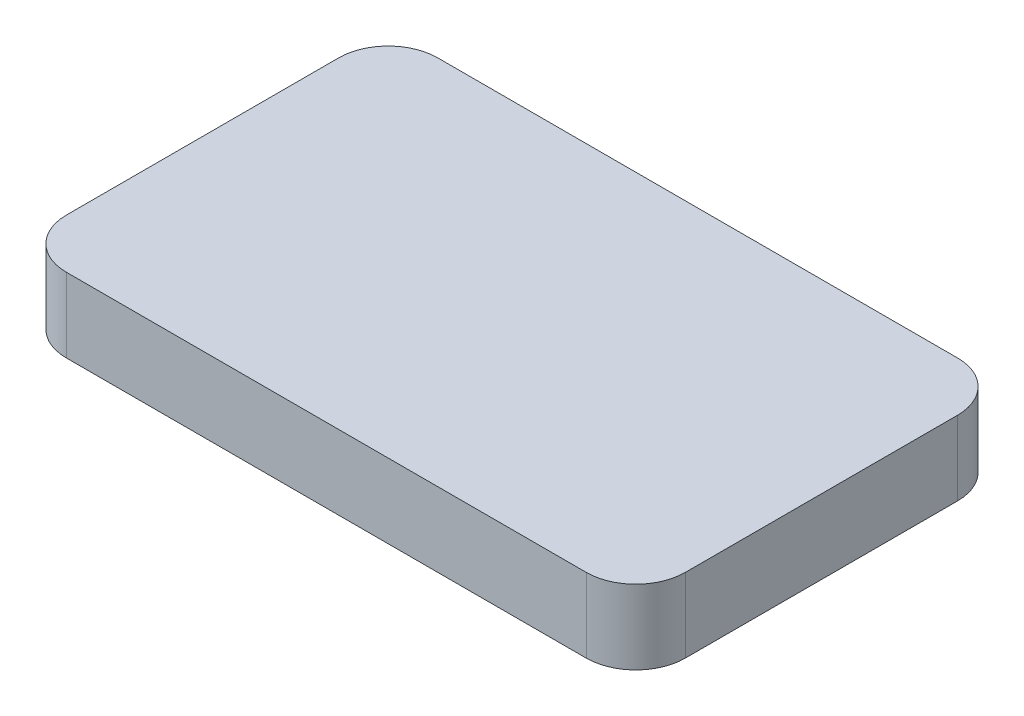
ISO-10303-21;
HEADER;
FILE_DESCRIPTION(('STEP AP214'),'2;1');
FILE_NAME('part.step','',(''),(''),'','','');
FILE_SCHEMA(('AUTOMOTIVE_DESIGN { 1 0 10303 214 1 1 1 1 }'));
ENDSEC;
DATA;
#1=APPLICATION_CONTEXT('core data for automotive mechanical design processes');
#2=APPLICATION_PROTOCOL_DEFINITION('international standard','automotive_design',2000,#1);
#3=PRODUCT_CONTEXT('',#1,'mechanical');
#4=PRODUCT('Part','Part','',(#3));
#5=PRODUCT_RELATED_PRODUCT_CATEGORY('part','',(#4));
#6=PRODUCT_DEFINITION_FORMATION('','',#4);
#7=PRODUCT_DEFINITION_CONTEXT('part definition',#1,'design');
#8=PRODUCT_DEFINITION('design','',#6,#7);
#9=PRODUCT_DEFINITION_SHAPE('','',#8);
#10=(LENGTH_UNIT() NAMED_UNIT(*) SI_UNIT(.MILLI.,.METRE.));
#11=(NAMED_UNIT(*) PLANE_ANGLE_UNIT() SI_UNIT($,.RADIAN.));
#12=(NAMED_UNIT(*) SI_UNIT($,.STERADIAN.) SOLID_ANGLE_UNIT());
#13=UNCERTAINTY_MEASURE_WITH_UNIT(LENGTH_MEASURE(1.E-05),#10,'distance_accuracy_value','');
#14=(GEOMETRIC_REPRESENTATION_CONTEXT(3) GLOBAL_UNCERTAINTY_ASSIGNED_CONTEXT((#13)) GLOBAL_UNIT_ASSIGNED_CONTEXT((#10,
#11,#12)) REPRESENTATION_CONTEXT('',''));
#15=CARTESIAN_POINT('',(0.,0.,0.));
#16=DIRECTION('',(0.,0.,1.));
#17=DIRECTION('',(1.,0.,0.));
#18=AXIS2_PLACEMENT_3D('',#15,#16,#17);
#19=CARTESIAN_POINT('',(12.5,3.,7.5));
#20=DIRECTION('',(-1.,0.,0.));
#21=DIRECTION('',(0.,0.,1.));
#22=AXIS2_PLACEMENT_3D('',#19,#20,#21);
#23=PLANE('',#22);
#24=DIRECTION('',(0.,0.,-1.));
#25=VECTOR('',#24,1.);
#26=CARTESIAN_POINT('',(12.5,0.,7.5));
#27=LINE('',#26,#25);
#28=CARTESIAN_POINT('',(12.5,0.,5.5));
#29=VERTEX_POINT('',#28);
#30=CARTESIAN_POINT('',(12.5,0.,-5.5));
#31=VERTEX_POINT('',#30);
#32=EDGE_CURVE('E135',#29,#31,#27,.T.);
#33=ORIENTED_EDGE('',*,*,#32,.T.);
#34=DIRECTION('',(0.,-1.,0.));
#35=VECTOR('',#34,1.);
#36=CARTESIAN_POINT('',(12.5,3.,-5.5));
#37=LINE('',#36,#35);
#38=CARTESIAN_POINT('',(12.5,3.,-5.5));
#39=VERTEX_POINT('',#38);
#40=EDGE_CURVE('E11',#31,#39,#37,.F.);
#41=ORIENTED_EDGE('',*,*,#40,.T.);
#42=DIRECTION('',(0.,0.,-1.));
#43=VECTOR('',#42,1.);
#44=CARTESIAN_POINT('',(12.5,3.,7.5));
#45=LINE('',#44,#43);
#46=CARTESIAN_POINT('',(12.5,3.,5.5));
#47=VERTEX_POINT('',#46);
#48=EDGE_CURVE('E133',#47,#39,#45,.T.);
#49=ORIENTED_EDGE('',*,*,#48,.F.);
#50=DIRECTION('',(0.,-1.,0.));
#51=VECTOR('',#50,1.);
#52=CARTESIAN_POINT('',(12.5,3.,5.5));
#53=LINE('',#52,#51);
#54=EDGE_CURVE('E47',#47,#29,#53,.T.);
#55=ORIENTED_EDGE('',*,*,#54,.T.);
#56=EDGE_LOOP('',(#33,#41,#49,#55));
#57=FACE_BOUND('',#56,.T.);
#58=ADVANCED_FACE('F39',(#57),#23,.F.);
#59=CARTESIAN_POINT('',(-12.5,3.,-7.5));
#60=DIRECTION('',(0.,0.,1.));
#61=DIRECTION('',(1.,0.,0.));
#62=AXIS2_PLACEMENT_3D('',#59,#60,#61);
#63=PLANE('',#62);
#64=DIRECTION('',(-1.,0.,0.));
#65=VECTOR('',#64,1.);
#66=CARTESIAN_POINT('',(-12.5,0.,-7.5));
#67=LINE('',#66,#65);
#68=CARTESIAN_POINT('',(10.5,0.,-7.5));
#69=VERTEX_POINT('',#68);
#70=CARTESIAN_POINT('',(-10.5,0.,-7.5));
#71=VERTEX_POINT('',#70);
#72=EDGE_CURVE('E131',#69,#71,#67,.T.);
#73=ORIENTED_EDGE('',*,*,#72,.T.);
#74=DIRECTION('',(0.,-1.,0.));
#75=VECTOR('',#74,1.);
#76=CARTESIAN_POINT('',(-10.5,3.,-7.5));
#77=LINE('',#76,#75);
#78=CARTESIAN_POINT('',(-10.5,3.,-7.5));
#79=VERTEX_POINT('',#78);
#80=EDGE_CURVE('E110',#71,#79,#77,.F.);
#81=ORIENTED_EDGE('',*,*,#80,.T.);
#82=DIRECTION('',(-1.,0.,0.));
#83=VECTOR('',#82,1.);
#84=CARTESIAN_POINT('',(-12.5,3.,-7.5));
#85=LINE('',#84,#83);
#86=CARTESIAN_POINT('',(10.5,3.,-7.5));
#87=VERTEX_POINT('',#86);
#88=EDGE_CURVE('E171',#87,#79,#85,.T.);
#89=ORIENTED_EDGE('',*,*,#88,.F.);
#90=DIRECTION('',(0.,-1.,0.));
#91=VECTOR('',#90,1.);
#92=CARTESIAN_POINT('',(10.5,3.,-7.5));
#93=LINE('',#92,#91);
#94=EDGE_CURVE('E115',#87,#69,#93,.T.);
#95=ORIENTED_EDGE('',*,*,#94,.T.);
#96=EDGE_LOOP('',(#73,#81,#89,#95));
#97=FACE_BOUND('',#96,.T.);
#98=ADVANCED_FACE('F181',(#97),#63,.F.);
#99=CARTESIAN_POINT('',(-12.5,3.,7.5));
#100=DIRECTION('',(1.,0.,0.));
#101=DIRECTION('',(0.,0.,-1.));
#102=AXIS2_PLACEMENT_3D('',#99,#100,#101);
#103=PLANE('',#102);
#104=DIRECTION('',(0.,0.,1.));
#105=VECTOR('',#104,1.);
#106=CARTESIAN_POINT('',(-12.5,3.,7.5));
#107=LINE('',#106,#105);
#108=CARTESIAN_POINT('',(-12.5,3.,-5.5));
#109=VERTEX_POINT('',#108);
#110=CARTESIAN_POINT('',(-12.5,3.,5.5));
#111=VERTEX_POINT('',#110);
#112=EDGE_CURVE('E124',#109,#111,#107,.T.);
#113=ORIENTED_EDGE('',*,*,#112,.F.);
#114=DIRECTION('',(0.,-1.,0.));
#115=VECTOR('',#114,1.);
#116=CARTESIAN_POINT('',(-12.5,3.,-5.5));
#117=LINE('',#116,#115);
#118=CARTESIAN_POINT('',(-12.5,0.,-5.5));
#119=VERTEX_POINT('',#118);
#120=EDGE_CURVE('E109',#109,#119,#117,.T.);
#121=ORIENTED_EDGE('',*,*,#120,.T.);
#122=DIRECTION('',(0.,0.,1.));
#123=VECTOR('',#122,1.);
#124=CARTESIAN_POINT('',(-12.5,0.,7.5));
#125=LINE('',#124,#123);
#126=CARTESIAN_POINT('',(-12.5,0.,5.5));
#127=VERTEX_POINT('',#126);
#128=EDGE_CURVE('E122',#119,#127,#125,.T.);
#129=ORIENTED_EDGE('',*,*,#128,.T.);
#130=DIRECTION('',(0.,-1.,0.));
#131=VECTOR('',#130,1.);
#132=CARTESIAN_POINT('',(-12.5,3.,5.5));
#133=LINE('',#132,#131);
#134=EDGE_CURVE('E126',#127,#111,#133,.F.);
#135=ORIENTED_EDGE('',*,*,#134,.T.);
#136=EDGE_LOOP('',(#113,#121,#129,#135));
#137=FACE_BOUND('',#136,.T.);
#138=ADVANCED_FACE('F121',(#137),#103,.F.);
#139=CARTESIAN_POINT('',(-12.5,3.,7.5));
#140=DIRECTION('',(0.,0.,-1.));
#141=DIRECTION('',(-1.,0.,0.));
#142=AXIS2_PLACEMENT_3D('',#139,#140,#141);
#143=PLANE('',#142);
#144=DIRECTION('',(1.,0.,0.));
#145=VECTOR('',#144,1.);
#146=CARTESIAN_POINT('',(-12.5,3.,7.5));
#147=LINE('',#146,#145);
#148=CARTESIAN_POINT('',(-10.5,3.,7.5));
#149=VERTEX_POINT('',#148);
#150=CARTESIAN_POINT('',(10.5,3.,7.5));
#151=VERTEX_POINT('',#150);
#152=EDGE_CURVE('E139',#149,#151,#147,.T.);
#153=ORIENTED_EDGE('',*,*,#152,.F.);
#154=DIRECTION('',(0.,-1.,0.));
#155=VECTOR('',#154,1.);
#156=CARTESIAN_POINT('',(-10.5,3.,7.5));
#157=LINE('',#156,#155);
#158=CARTESIAN_POINT('',(-10.5,0.,7.5));
#159=VERTEX_POINT('',#158);
#160=EDGE_CURVE('E156',#149,#159,#157,.T.);
#161=ORIENTED_EDGE('',*,*,#160,.T.);
#162=DIRECTION('',(1.,0.,0.));
#163=VECTOR('',#162,1.);
#164=CARTESIAN_POINT('',(-12.5,0.,7.5));
#165=LINE('',#164,#163);
#166=CARTESIAN_POINT('',(10.5,0.,7.5));
#167=VERTEX_POINT('',#166);
#168=EDGE_CURVE('E130',#159,#167,#165,.T.);
#169=ORIENTED_EDGE('',*,*,#168,.T.);
#170=DIRECTION('',(0.,-1.,0.));
#171=VECTOR('',#170,1.);
#172=CARTESIAN_POINT('',(10.5,3.,7.5));
#173=LINE('',#172,#171);
#174=EDGE_CURVE('E54',#167,#151,#173,.F.);
#175=ORIENTED_EDGE('',*,*,#174,.T.);
#176=EDGE_LOOP('',(#153,#161,#169,#175));
#177=FACE_BOUND('',#176,.T.);
#178=ADVANCED_FACE('F185',(#177),#143,.F.);
#179=CARTESIAN_POINT('',(0.,3.,0.));
#180=DIRECTION('',(0.,-1.,0.));
#181=DIRECTION('',(0.,0.,-1.));
#182=AXIS2_PLACEMENT_3D('',#179,#180,#181);
#183=PLANE('',#182);
#184=ORIENTED_EDGE('',*,*,#88,.T.);
#185=CARTESIAN_POINT('',(-10.5,3.,-5.5));
#186=DIRECTION('',(0.,-1.,0.));
#187=DIRECTION('',(0.,0.,-1.));
#188=AXIS2_PLACEMENT_3D('',#185,#186,#187);
#189=CIRCLE('',#188,2.);
#190=EDGE_CURVE('E153',#79,#109,#189,.F.);
#191=ORIENTED_EDGE('',*,*,#190,.T.);
#192=ORIENTED_EDGE('',*,*,#112,.T.);
#193=CARTESIAN_POINT('',(-10.5,3.,5.5));
#194=DIRECTION('',(0.,-1.,0.));
#195=DIRECTION('',(0.,0.,-1.));
#196=AXIS2_PLACEMENT_3D('',#193,#194,#195);
#197=CIRCLE('',#196,2.);
#198=EDGE_CURVE('E61',#111,#149,#197,.F.);
#199=ORIENTED_EDGE('',*,*,#198,.T.);
#200=ORIENTED_EDGE('',*,*,#152,.T.);
#201=CARTESIAN_POINT('',(10.5,3.,5.5));
#202=DIRECTION('',(0.,-1.,0.));
#203=DIRECTION('',(0.,0.,-1.));
#204=AXIS2_PLACEMENT_3D('',#201,#202,#203);
#205=CIRCLE('',#204,2.);
#206=EDGE_CURVE('E148',#151,#47,#205,.F.);
#207=ORIENTED_EDGE('',*,*,#206,.T.);
#208=ORIENTED_EDGE('',*,*,#48,.T.);
#209=CARTESIAN_POINT('',(10.5,3.,-5.5));
#210=DIRECTION('',(0.,-1.,0.));
#211=DIRECTION('',(0.,0.,-1.));
#212=AXIS2_PLACEMENT_3D('',#209,#210,#211);
#213=CIRCLE('',#212,2.);
#214=EDGE_CURVE('E150',#39,#87,#213,.F.);
#215=ORIENTED_EDGE('',*,*,#214,.T.);
#216=EDGE_LOOP('',(#184,#191,#192,#199,#200,#207,#208,#215));
#217=FACE_BOUND('',#216,.T.);
#218=ADVANCED_FACE('F175',(#217),#183,.F.);
#219=CARTESIAN_POINT('',(0.,0.,0.));
#220=DIRECTION('',(0.,-1.,0.));
#221=DIRECTION('',(0.,0.,-1.));
#222=AXIS2_PLACEMENT_3D('',#219,#220,#221);
#223=PLANE('',#222);
#224=ORIENTED_EDGE('',*,*,#128,.F.);
#225=CARTESIAN_POINT('',(-10.5,0.,-5.5));
#226=DIRECTION('',(0.,-1.,0.));
#227=DIRECTION('',(0.,0.,-1.));
#228=AXIS2_PLACEMENT_3D('',#225,#226,#227);
#229=CIRCLE('',#228,2.);
#230=EDGE_CURVE('E105',#119,#71,#229,.T.);
#231=ORIENTED_EDGE('',*,*,#230,.T.);
#232=ORIENTED_EDGE('',*,*,#72,.F.);
#233=CARTESIAN_POINT('',(10.5,0.,-5.5));
#234=DIRECTION('',(0.,-1.,0.));
#235=DIRECTION('',(0.,0.,-1.));
#236=AXIS2_PLACEMENT_3D('',#233,#234,#235);
#237=CIRCLE('',#236,2.);
#238=EDGE_CURVE('E142',#69,#31,#237,.T.);
#239=ORIENTED_EDGE('',*,*,#238,.T.);
#240=ORIENTED_EDGE('',*,*,#32,.F.);
#241=CARTESIAN_POINT('',(10.5,0.,5.5));
#242=DIRECTION('',(0.,-1.,0.));
#243=DIRECTION('',(0.,0.,-1.));
#244=AXIS2_PLACEMENT_3D('',#241,#242,#243);
#245=CIRCLE('',#244,2.);
#246=EDGE_CURVE('E125',#29,#167,#245,.T.);
#247=ORIENTED_EDGE('',*,*,#246,.T.);
#248=ORIENTED_EDGE('',*,*,#168,.F.);
#249=CARTESIAN_POINT('',(-10.5,0.,5.5));
#250=DIRECTION('',(0.,-1.,0.));
#251=DIRECTION('',(0.,0.,-1.));
#252=AXIS2_PLACEMENT_3D('',#249,#250,#251);
#253=CIRCLE('',#252,2.);
#254=EDGE_CURVE('E116',#159,#127,#253,.T.);
#255=ORIENTED_EDGE('',*,*,#254,.T.);
#256=EDGE_LOOP('',(#224,#231,#232,#239,#240,#247,#248,#255));
#257=FACE_BOUND('',#256,.T.);
#258=ADVANCED_FACE('F128',(#257),#223,.T.);
#259=CARTESIAN_POINT('',(-10.5,3.,-5.5));
#260=DIRECTION('',(0.,-1.,0.));
#261=DIRECTION('',(0.,0.,-1.));
#262=AXIS2_PLACEMENT_3D('',#259,#260,#261);
#263=CYLINDRICAL_SURFACE('',#262,2.);
#264=ORIENTED_EDGE('',*,*,#190,.F.);
#265=ORIENTED_EDGE('',*,*,#80,.F.);
#266=ORIENTED_EDGE('',*,*,#230,.F.);
#267=ORIENTED_EDGE('',*,*,#120,.F.);
#268=EDGE_LOOP('',(#264,#265,#266,#267));
#269=FACE_BOUND('',#268,.T.);
#270=ADVANCED_FACE('F108',(#269),#263,.T.);
#271=CARTESIAN_POINT('',(-10.5,3.,5.5));
#272=DIRECTION('',(0.,-1.,0.));
#273=DIRECTION('',(0.,0.,-1.));
#274=AXIS2_PLACEMENT_3D('',#271,#272,#273);
#275=CYLINDRICAL_SURFACE('',#274,2.);
#276=ORIENTED_EDGE('',*,*,#198,.F.);
#277=ORIENTED_EDGE('',*,*,#134,.F.);
#278=ORIENTED_EDGE('',*,*,#254,.F.);
#279=ORIENTED_EDGE('',*,*,#160,.F.);
#280=EDGE_LOOP('',(#276,#277,#278,#279));
#281=FACE_BOUND('',#280,.T.);
#282=ADVANCED_FACE('F184',(#281),#275,.T.);
#283=CARTESIAN_POINT('',(10.5,3.,-5.5));
#284=DIRECTION('',(0.,-1.,0.));
#285=DIRECTION('',(0.,0.,-1.));
#286=AXIS2_PLACEMENT_3D('',#283,#284,#285);
#287=CYLINDRICAL_SURFACE('',#286,2.);
#288=ORIENTED_EDGE('',*,*,#214,.F.);
#289=ORIENTED_EDGE('',*,*,#40,.F.);
#290=ORIENTED_EDGE('',*,*,#238,.F.);
#291=ORIENTED_EDGE('',*,*,#94,.F.);
#292=EDGE_LOOP('',(#288,#289,#290,#291));
#293=FACE_BOUND('',#292,.T.);
#294=ADVANCED_FACE('F179',(#293),#287,.T.);
#295=CARTESIAN_POINT('',(10.5,3.,5.5));
#296=DIRECTION('',(0.,-1.,0.));
#297=DIRECTION('',(0.,0.,-1.));
#298=AXIS2_PLACEMENT_3D('',#295,#296,#297);
#299=CYLINDRICAL_SURFACE('',#298,2.);
#300=ORIENTED_EDGE('',*,*,#206,.F.);
#301=ORIENTED_EDGE('',*,*,#174,.F.);
#302=ORIENTED_EDGE('',*,*,#246,.F.);
#303=ORIENTED_EDGE('',*,*,#54,.F.);
#304=EDGE_LOOP('',(#300,#301,#302,#303));
#305=FACE_BOUND('',#304,.T.);
#306=ADVANCED_FACE('F41',(#305),#299,.T.);
#307=CLOSED_SHELL('',(#58,#98,#138,#178,#218,#258,#270,#282,#294,#306));
#308=MANIFOLD_SOLID_BREP('B2',#307);
#309=ADVANCED_BREP_SHAPE_REPRESENTATION('',(#18,#308),#14);
#310=SHAPE_DEFINITION_REPRESENTATION(#9,#309);
ENDSEC;
END-ISO-10303-21;
